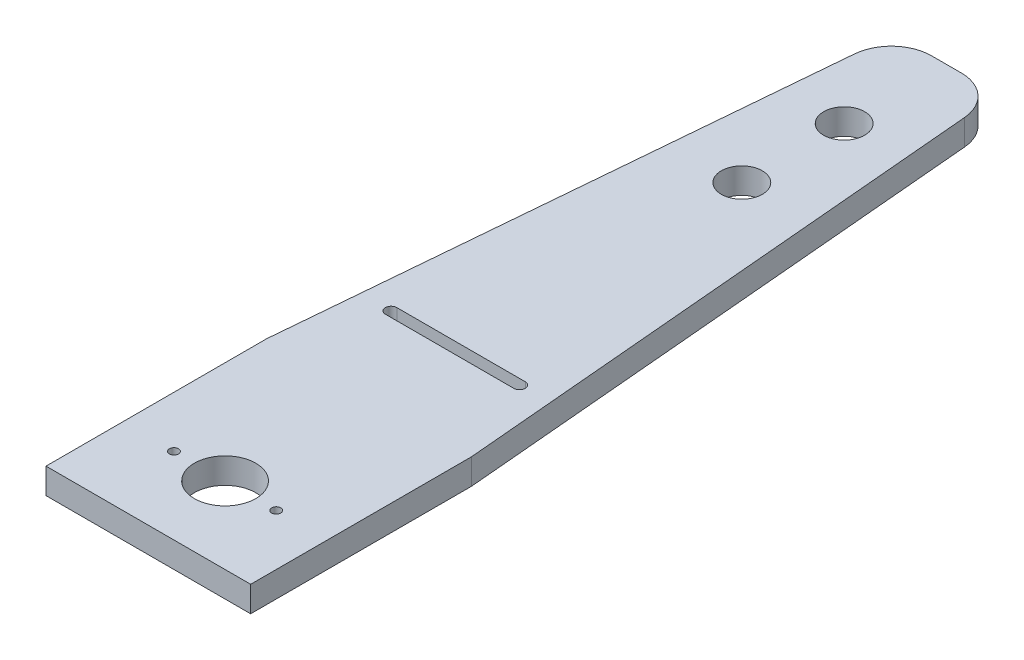
ISO-10303-21;
HEADER;
FILE_DESCRIPTION(('STEP AP214'),'2;1');
FILE_NAME('part.step','',(''),(''),'','','');
FILE_SCHEMA(('AUTOMOTIVE_DESIGN { 1 0 10303 214 1 1 1 1 }'));
ENDSEC;
DATA;
#1=APPLICATION_CONTEXT('core data for automotive mechanical design processes');
#2=APPLICATION_PROTOCOL_DEFINITION('international standard','automotive_design',2000,#1);
#3=PRODUCT_CONTEXT('',#1,'mechanical');
#4=PRODUCT('Part','Part','',(#3));
#5=PRODUCT_RELATED_PRODUCT_CATEGORY('part','',(#4));
#6=PRODUCT_DEFINITION_FORMATION('','',#4);
#7=PRODUCT_DEFINITION_CONTEXT('part definition',#1,'design');
#8=PRODUCT_DEFINITION('design','',#6,#7);
#9=PRODUCT_DEFINITION_SHAPE('','',#8);
#10=(LENGTH_UNIT() NAMED_UNIT(*) SI_UNIT(.MILLI.,.METRE.));
#11=(NAMED_UNIT(*) PLANE_ANGLE_UNIT() SI_UNIT($,.RADIAN.));
#12=(NAMED_UNIT(*) SI_UNIT($,.STERADIAN.) SOLID_ANGLE_UNIT());
#13=UNCERTAINTY_MEASURE_WITH_UNIT(LENGTH_MEASURE(1.E-05),#10,'distance_accuracy_value','');
#14=(GEOMETRIC_REPRESENTATION_CONTEXT(3) GLOBAL_UNCERTAINTY_ASSIGNED_CONTEXT((#13)) GLOBAL_UNIT_ASSIGNED_CONTEXT((#10,
#11,#12)) REPRESENTATION_CONTEXT('',''));
#15=CARTESIAN_POINT('',(0.,0.,0.));
#16=DIRECTION('',(0.,0.,1.));
#17=DIRECTION('',(1.,0.,0.));
#18=AXIS2_PLACEMENT_3D('',#15,#16,#17);
#19=CARTESIAN_POINT('',(0.,6.35,0.));
#20=DIRECTION('',(0.,-1.,0.));
#21=DIRECTION('',(0.,0.,-1.));
#22=AXIS2_PLACEMENT_3D('',#19,#20,#21);
#23=PLANE('',#22);
#24=DIRECTION('',(1.,0.,0.));
#25=VECTOR('',#24,1.);
#26=CARTESIAN_POINT('',(9.45935826457544,6.35,-74.7776));
#27=LINE('',#26,#25);
#28=CARTESIAN_POINT('',(9.45935826457544,6.35,-74.7776));
#29=VERTEX_POINT('',#28);
#30=CARTESIAN_POINT('',(41.3406417354246,6.35,-74.7776));
#31=VERTEX_POINT('',#30);
#32=EDGE_CURVE('E149',#29,#31,#27,.T.);
#33=ORIENTED_EDGE('',*,*,#32,.F.);
#34=CARTESIAN_POINT('',(9.45935826457544,6.35,-76.2));
#35=DIRECTION('',(0.,1.,0.));
#36=DIRECTION('',(0.,0.,1.));
#37=AXIS2_PLACEMENT_3D('',#34,#35,#36);
#38=CIRCLE('',#37,1.4224);
#39=CARTESIAN_POINT('',(9.45935826457544,6.35,-77.6224));
#40=VERTEX_POINT('',#39);
#41=EDGE_CURVE('E64',#40,#29,#38,.T.);
#42=ORIENTED_EDGE('',*,*,#41,.F.);
#43=DIRECTION('',(-1.,0.,0.));
#44=VECTOR('',#43,1.);
#45=CARTESIAN_POINT('',(9.45935826457544,6.35,-77.6224));
#46=LINE('',#45,#44);
#47=CARTESIAN_POINT('',(41.3406417354246,6.35,-77.6224));
#48=VERTEX_POINT('',#47);
#49=EDGE_CURVE('E155',#48,#40,#46,.T.);
#50=ORIENTED_EDGE('',*,*,#49,.F.);
#51=CARTESIAN_POINT('',(41.3406417354246,6.35,-76.2));
#52=DIRECTION('',(0.,1.,0.));
#53=DIRECTION('',(0.,0.,1.));
#54=AXIS2_PLACEMENT_3D('',#51,#52,#53);
#55=CIRCLE('',#54,1.4224);
#56=EDGE_CURVE('E140',#31,#48,#55,.T.);
#57=ORIENTED_EDGE('',*,*,#56,.F.);
#58=EDGE_LOOP('',(#33,#42,#50,#57));
#59=FACE_BOUND('',#58,.T.);
#60=CARTESIAN_POINT('',(25.4,6.35,-172.72));
#61=DIRECTION('',(0.,1.,0.));
#62=DIRECTION('',(0.,0.,1.));
#63=AXIS2_PLACEMENT_3D('',#60,#61,#62);
#64=CIRCLE('',#63,5.07999999999999);
#65=CARTESIAN_POINT('',(25.4,6.35,-167.64));
#66=VERTEX_POINT('',#65);
#67=EDGE_CURVE('E169',#66,#66,#64,.T.);
#68=ORIENTED_EDGE('',*,*,#67,.F.);
#69=EDGE_LOOP('',(#68));
#70=FACE_BOUND('',#69,.T.);
#71=CARTESIAN_POINT('',(25.4,6.35,-147.32));
#72=DIRECTION('',(0.,1.,0.));
#73=DIRECTION('',(0.,0.,1.));
#74=AXIS2_PLACEMENT_3D('',#71,#72,#73);
#75=CIRCLE('',#74,5.07999999999999);
#76=CARTESIAN_POINT('',(25.4,6.35,-142.24));
#77=VERTEX_POINT('',#76);
#78=EDGE_CURVE('E172',#77,#77,#75,.T.);
#79=ORIENTED_EDGE('',*,*,#78,.F.);
#80=EDGE_LOOP('',(#79));
#81=FACE_BOUND('',#80,.T.);
#82=DIRECTION('',(-1.,0.,0.));
#83=VECTOR('',#82,1.);
#84=CARTESIAN_POINT('',(0.,6.35,-198.12));
#85=LINE('',#84,#83);
#86=CARTESIAN_POINT('',(29.0966882598258,6.35,-198.12));
#87=VERTEX_POINT('',#86);
#88=CARTESIAN_POINT('',(21.7033117401742,6.35,-198.12));
#89=VERTEX_POINT('',#88);
#90=EDGE_CURVE('E203',#87,#89,#85,.T.);
#91=ORIENTED_EDGE('',*,*,#90,.T.);
#92=CARTESIAN_POINT('',(21.7033117401742,6.35,-188.12));
#93=DIRECTION('',(0.,-1.,0.));
#94=DIRECTION('',(0.,0.,-1.));
#95=AXIS2_PLACEMENT_3D('',#92,#93,#94);
#96=CIRCLE('',#95,10.);
#97=CARTESIAN_POINT('',(11.7413647592568,6.35,-188.991557427477));
#98=VERTEX_POINT('',#97);
#99=EDGE_CURVE('E243',#89,#98,#96,.F.);
#100=ORIENTED_EDGE('',*,*,#99,.T.);
#101=DIRECTION('',(0.0871557427476599,0.,-0.996194698091746));
#102=VECTOR('',#101,1.);
#103=CARTESIAN_POINT('',(0.,6.35,-54.7871441233755));
#104=LINE('',#103,#102);
#105=CARTESIAN_POINT('',(0.,6.35,-54.7871441233755));
#106=VERTEX_POINT('',#105);
#107=EDGE_CURVE('E227',#98,#106,#104,.F.);
#108=ORIENTED_EDGE('',*,*,#107,.T.);
#109=DIRECTION('',(0.,0.,1.));
#110=VECTOR('',#109,1.);
#111=CARTESIAN_POINT('',(0.,6.35,0.));
#112=LINE('',#111,#110);
#113=CARTESIAN_POINT('',(0.,6.35,0.));
#114=VERTEX_POINT('',#113);
#115=EDGE_CURVE('E195',#106,#114,#112,.T.);
#116=ORIENTED_EDGE('',*,*,#115,.T.);
#117=DIRECTION('',(1.,0.,0.));
#118=VECTOR('',#117,1.);
#119=CARTESIAN_POINT('',(0.,6.35,0.));
#120=LINE('',#119,#118);
#121=CARTESIAN_POINT('',(50.8,6.35,0.));
#122=VERTEX_POINT('',#121);
#123=EDGE_CURVE('E197',#114,#122,#120,.T.);
#124=ORIENTED_EDGE('',*,*,#123,.T.);
#125=DIRECTION('',(0.,0.,-1.));
#126=VECTOR('',#125,1.);
#127=CARTESIAN_POINT('',(50.8,6.35,0.));
#128=LINE('',#127,#126);
#129=CARTESIAN_POINT('',(50.8,6.35,-54.7871441233756));
#130=VERTEX_POINT('',#129);
#131=EDGE_CURVE('E200',#122,#130,#128,.T.);
#132=ORIENTED_EDGE('',*,*,#131,.T.);
#133=DIRECTION('',(0.0871557427476599,0.,0.996194698091746));
#134=VECTOR('',#133,1.);
#135=CARTESIAN_POINT('',(38.26,6.35,-198.12));
#136=LINE('',#135,#134);
#137=CARTESIAN_POINT('',(39.0586352407432,6.35,-188.991557427477));
#138=VERTEX_POINT('',#137);
#139=EDGE_CURVE('E229',#130,#138,#136,.F.);
#140=ORIENTED_EDGE('',*,*,#139,.T.);
#141=CARTESIAN_POINT('',(29.0966882598258,6.35,-188.12));
#142=DIRECTION('',(0.,-1.,0.));
#143=DIRECTION('',(0.,0.,-1.));
#144=AXIS2_PLACEMENT_3D('',#141,#142,#143);
#145=CIRCLE('',#144,10.);
#146=EDGE_CURVE('E241',#138,#87,#145,.F.);
#147=ORIENTED_EDGE('',*,*,#146,.T.);
#148=EDGE_LOOP('',(#91,#100,#108,#116,#124,#132,#140,#147));
#149=FACE_BOUND('',#148,.T.);
#150=CARTESIAN_POINT('',(12.7,6.35,-19.05));
#151=DIRECTION('',(0.,1.,0.));
#152=DIRECTION('',(0.,0.,1.));
#153=AXIS2_PLACEMENT_3D('',#150,#151,#152);
#154=CIRCLE('',#153,1.1303);
#155=CARTESIAN_POINT('',(12.7,6.35,-17.9197));
#156=VERTEX_POINT('',#155);
#157=EDGE_CURVE('E189',#156,#156,#154,.T.);
#158=ORIENTED_EDGE('',*,*,#157,.F.);
#159=EDGE_LOOP('',(#158));
#160=FACE_BOUND('',#159,.T.);
#161=CARTESIAN_POINT('',(38.1,6.35,-19.05));
#162=DIRECTION('',(0.,1.,0.));
#163=DIRECTION('',(0.,0.,1.));
#164=AXIS2_PLACEMENT_3D('',#161,#162,#163);
#165=CIRCLE('',#164,1.1303);
#166=CARTESIAN_POINT('',(38.1,6.35,-17.9197));
#167=VERTEX_POINT('',#166);
#168=EDGE_CURVE('E183',#167,#167,#165,.T.);
#169=ORIENTED_EDGE('',*,*,#168,.F.);
#170=EDGE_LOOP('',(#169));
#171=FACE_BOUND('',#170,.T.);
#172=CARTESIAN_POINT('',(25.4,6.35,-19.05));
#173=DIRECTION('',(0.,1.,0.));
#174=DIRECTION('',(0.,0.,1.));
#175=AXIS2_PLACEMENT_3D('',#172,#173,#174);
#176=CIRCLE('',#175,7.62);
#177=CARTESIAN_POINT('',(25.4,6.35,-11.43));
#178=VERTEX_POINT('',#177);
#179=EDGE_CURVE('E177',#178,#178,#176,.T.);
#180=ORIENTED_EDGE('',*,*,#179,.F.);
#181=EDGE_LOOP('',(#180));
#182=FACE_BOUND('',#181,.T.);
#183=ADVANCED_FACE('F49',(#59,#70,#81,#149,#160,#171,#182),#23,.F.);
#184=CARTESIAN_POINT('',(0.,0.,0.));
#185=DIRECTION('',(0.,-1.,0.));
#186=DIRECTION('',(0.,0.,-1.));
#187=AXIS2_PLACEMENT_3D('',#184,#185,#186);
#188=PLANE('',#187);
#189=CARTESIAN_POINT('',(9.45935826457544,0.,-76.2));
#190=DIRECTION('',(0.,-1.,0.));
#191=DIRECTION('',(0.,0.,-1.));
#192=AXIS2_PLACEMENT_3D('',#189,#190,#191);
#193=CIRCLE('',#192,1.4224);
#194=CARTESIAN_POINT('',(9.45935826457544,0.,-74.7776));
#195=VERTEX_POINT('',#194);
#196=CARTESIAN_POINT('',(9.45935826457544,0.,-77.6224));
#197=VERTEX_POINT('',#196);
#198=EDGE_CURVE('E11',#195,#197,#193,.T.);
#199=ORIENTED_EDGE('',*,*,#198,.F.);
#200=DIRECTION('',(-1.,0.,0.));
#201=VECTOR('',#200,1.);
#202=CARTESIAN_POINT('',(0.,0.,-74.7776));
#203=LINE('',#202,#201);
#204=CARTESIAN_POINT('',(41.3406417354246,0.,-74.7776));
#205=VERTEX_POINT('',#204);
#206=EDGE_CURVE('E253',#205,#195,#203,.T.);
#207=ORIENTED_EDGE('',*,*,#206,.F.);
#208=CARTESIAN_POINT('',(41.3406417354246,0.,-76.2));
#209=DIRECTION('',(0.,-1.,0.));
#210=DIRECTION('',(0.,0.,-1.));
#211=AXIS2_PLACEMENT_3D('',#208,#209,#210);
#212=CIRCLE('',#211,1.4224);
#213=CARTESIAN_POINT('',(41.3406417354246,0.,-77.6224));
#214=VERTEX_POINT('',#213);
#215=EDGE_CURVE('E143',#214,#205,#212,.T.);
#216=ORIENTED_EDGE('',*,*,#215,.F.);
#217=DIRECTION('',(1.,0.,0.));
#218=VECTOR('',#217,1.);
#219=CARTESIAN_POINT('',(0.,0.,-77.6224));
#220=LINE('',#219,#218);
#221=EDGE_CURVE('E57',#197,#214,#220,.T.);
#222=ORIENTED_EDGE('',*,*,#221,.F.);
#223=EDGE_LOOP('',(#199,#207,#216,#222));
#224=FACE_BOUND('',#223,.T.);
#225=CARTESIAN_POINT('',(25.4,0.,-172.72));
#226=DIRECTION('',(0.,1.,0.));
#227=DIRECTION('',(0.,0.,1.));
#228=AXIS2_PLACEMENT_3D('',#225,#226,#227);
#229=CIRCLE('',#228,5.07999999999999);
#230=CARTESIAN_POINT('',(25.4,0.,-167.64));
#231=VERTEX_POINT('',#230);
#232=EDGE_CURVE('E165',#231,#231,#229,.T.);
#233=ORIENTED_EDGE('',*,*,#232,.T.);
#234=EDGE_LOOP('',(#233));
#235=FACE_BOUND('',#234,.T.);
#236=CARTESIAN_POINT('',(25.4,0.,-147.32));
#237=DIRECTION('',(0.,1.,0.));
#238=DIRECTION('',(0.,0.,1.));
#239=AXIS2_PLACEMENT_3D('',#236,#237,#238);
#240=CIRCLE('',#239,5.07999999999999);
#241=CARTESIAN_POINT('',(25.4,0.,-142.24));
#242=VERTEX_POINT('',#241);
#243=EDGE_CURVE('E162',#242,#242,#240,.T.);
#244=ORIENTED_EDGE('',*,*,#243,.T.);
#245=EDGE_LOOP('',(#244));
#246=FACE_BOUND('',#245,.T.);
#247=CARTESIAN_POINT('',(38.1,0.,-19.05));
#248=DIRECTION('',(0.,1.,0.));
#249=DIRECTION('',(0.,0.,1.));
#250=AXIS2_PLACEMENT_3D('',#247,#248,#249);
#251=CIRCLE('',#250,1.1303);
#252=CARTESIAN_POINT('',(38.1,0.,-17.9197));
#253=VERTEX_POINT('',#252);
#254=EDGE_CURVE('E180',#253,#253,#251,.T.);
#255=ORIENTED_EDGE('',*,*,#254,.T.);
#256=EDGE_LOOP('',(#255));
#257=FACE_BOUND('',#256,.T.);
#258=DIRECTION('',(-0.0871557427476599,0.,0.996194698091746));
#259=VECTOR('',#258,1.);
#260=CARTESIAN_POINT('',(-4.75684386829991,0.,-0.416169912639054));
#261=LINE('',#260,#259);
#262=CARTESIAN_POINT('',(0.,0.,-54.7871441233755));
#263=VERTEX_POINT('',#262);
#264=CARTESIAN_POINT('',(11.7413647592568,0.,-188.991557427477));
#265=VERTEX_POINT('',#264);
#266=EDGE_CURVE('E220',#263,#265,#261,.F.);
#267=ORIENTED_EDGE('',*,*,#266,.T.);
#268=CARTESIAN_POINT('',(21.7033117401742,0.,-188.12));
#269=DIRECTION('',(0.,-1.,0.));
#270=DIRECTION('',(0.,0.,-1.));
#271=AXIS2_PLACEMENT_3D('',#268,#269,#270);
#272=CIRCLE('',#271,10.);
#273=CARTESIAN_POINT('',(21.7033117401742,0.,-198.12));
#274=VERTEX_POINT('',#273);
#275=EDGE_CURVE('E249',#265,#274,#272,.T.);
#276=ORIENTED_EDGE('',*,*,#275,.T.);
#277=DIRECTION('',(-1.,0.,0.));
#278=VECTOR('',#277,1.);
#279=CARTESIAN_POINT('',(0.,0.,-198.12));
#280=LINE('',#279,#278);
#281=CARTESIAN_POINT('',(29.0966882598258,0.,-198.12));
#282=VERTEX_POINT('',#281);
#283=EDGE_CURVE('E198',#282,#274,#280,.T.);
#284=ORIENTED_EDGE('',*,*,#283,.F.);
#285=CARTESIAN_POINT('',(29.0966882598258,0.,-188.12));
#286=DIRECTION('',(0.,-1.,0.));
#287=DIRECTION('',(0.,0.,-1.));
#288=AXIS2_PLACEMENT_3D('',#285,#286,#287);
#289=CIRCLE('',#288,10.);
#290=CARTESIAN_POINT('',(39.0586352407432,0.,-188.991557427477));
#291=VERTEX_POINT('',#290);
#292=EDGE_CURVE('E247',#282,#291,#289,.T.);
#293=ORIENTED_EDGE('',*,*,#292,.T.);
#294=DIRECTION('',(-0.0871557427476599,0.,-0.996194698091746));
#295=VECTOR('',#294,1.);
#296=CARTESIAN_POINT('',(55.17096079481,0.,-4.82683362537917));
#297=LINE('',#296,#295);
#298=CARTESIAN_POINT('',(50.8,0.,-54.7871441233756));
#299=VERTEX_POINT('',#298);
#300=EDGE_CURVE('E223',#291,#299,#297,.F.);
#301=ORIENTED_EDGE('',*,*,#300,.T.);
#302=DIRECTION('',(0.,0.,-1.));
#303=VECTOR('',#302,1.);
#304=CARTESIAN_POINT('',(50.8,0.,0.));
#305=LINE('',#304,#303);
#306=CARTESIAN_POINT('',(50.8,0.,0.));
#307=VERTEX_POINT('',#306);
#308=EDGE_CURVE('E210',#307,#299,#305,.T.);
#309=ORIENTED_EDGE('',*,*,#308,.F.);
#310=DIRECTION('',(1.,0.,0.));
#311=VECTOR('',#310,1.);
#312=CARTESIAN_POINT('',(0.,0.,0.));
#313=LINE('',#312,#311);
#314=CARTESIAN_POINT('',(0.,0.,0.));
#315=VERTEX_POINT('',#314);
#316=EDGE_CURVE('E208',#315,#307,#313,.T.);
#317=ORIENTED_EDGE('',*,*,#316,.F.);
#318=DIRECTION('',(0.,0.,1.));
#319=VECTOR('',#318,1.);
#320=CARTESIAN_POINT('',(0.,0.,0.));
#321=LINE('',#320,#319);
#322=EDGE_CURVE('E192',#263,#315,#321,.T.);
#323=ORIENTED_EDGE('',*,*,#322,.F.);
#324=EDGE_LOOP('',(#267,#276,#284,#293,#301,#309,#317,#323));
#325=FACE_BOUND('',#324,.T.);
#326=CARTESIAN_POINT('',(12.7,0.,-19.05));
#327=DIRECTION('',(0.,1.,0.));
#328=DIRECTION('',(0.,0.,1.));
#329=AXIS2_PLACEMENT_3D('',#326,#327,#328);
#330=CIRCLE('',#329,1.1303);
#331=CARTESIAN_POINT('',(12.7,0.,-17.9197));
#332=VERTEX_POINT('',#331);
#333=EDGE_CURVE('E186',#332,#332,#330,.T.);
#334=ORIENTED_EDGE('',*,*,#333,.T.);
#335=EDGE_LOOP('',(#334));
#336=FACE_BOUND('',#335,.T.);
#337=CARTESIAN_POINT('',(25.4,0.,-19.05));
#338=DIRECTION('',(0.,1.,0.));
#339=DIRECTION('',(0.,0.,1.));
#340=AXIS2_PLACEMENT_3D('',#337,#338,#339);
#341=CIRCLE('',#340,7.62);
#342=CARTESIAN_POINT('',(25.4,0.,-11.43));
#343=VERTEX_POINT('',#342);
#344=EDGE_CURVE('E168',#343,#343,#341,.T.);
#345=ORIENTED_EDGE('',*,*,#344,.T.);
#346=EDGE_LOOP('',(#345));
#347=FACE_BOUND('',#346,.T.);
#348=ADVANCED_FACE('F261',(#224,#235,#246,#257,#325,#336,#347),#188,.T.);
#349=CARTESIAN_POINT('',(0.,6.35,0.));
#350=DIRECTION('',(1.,0.,0.));
#351=DIRECTION('',(0.,0.,-1.));
#352=AXIS2_PLACEMENT_3D('',#349,#350,#351);
#353=PLANE('',#352);
#354=ORIENTED_EDGE('',*,*,#115,.F.);
#355=DIRECTION('',(0.,-1.,0.));
#356=VECTOR('',#355,1.);
#357=CARTESIAN_POINT('',(0.,6.35,-54.7871441233755));
#358=LINE('',#357,#356);
#359=EDGE_CURVE('E232',#106,#263,#358,.T.);
#360=ORIENTED_EDGE('',*,*,#359,.T.);
#361=ORIENTED_EDGE('',*,*,#322,.T.);
#362=DIRECTION('',(0.,-1.,0.));
#363=VECTOR('',#362,1.);
#364=CARTESIAN_POINT('',(0.,6.35,0.));
#365=LINE('',#364,#363);
#366=EDGE_CURVE('E217',#114,#315,#365,.T.);
#367=ORIENTED_EDGE('',*,*,#366,.F.);
#368=EDGE_LOOP('',(#354,#360,#361,#367));
#369=FACE_BOUND('',#368,.T.);
#370=ADVANCED_FACE('F280',(#369),#353,.F.);
#371=CARTESIAN_POINT('',(0.,6.35,0.));
#372=DIRECTION('',(0.,0.,-1.));
#373=DIRECTION('',(-1.,0.,0.));
#374=AXIS2_PLACEMENT_3D('',#371,#372,#373);
#375=PLANE('',#374);
#376=ORIENTED_EDGE('',*,*,#316,.T.);
#377=DIRECTION('',(0.,-1.,0.));
#378=VECTOR('',#377,1.);
#379=CARTESIAN_POINT('',(50.8,6.35,0.));
#380=LINE('',#379,#378);
#381=EDGE_CURVE('E206',#122,#307,#380,.T.);
#382=ORIENTED_EDGE('',*,*,#381,.F.);
#383=ORIENTED_EDGE('',*,*,#123,.F.);
#384=ORIENTED_EDGE('',*,*,#366,.T.);
#385=EDGE_LOOP('',(#376,#382,#383,#384));
#386=FACE_BOUND('',#385,.T.);
#387=ADVANCED_FACE('F293',(#386),#375,.F.);
#388=CARTESIAN_POINT('',(50.8,6.35,0.));
#389=DIRECTION('',(-1.,0.,0.));
#390=DIRECTION('',(0.,0.,1.));
#391=AXIS2_PLACEMENT_3D('',#388,#389,#390);
#392=PLANE('',#391);
#393=ORIENTED_EDGE('',*,*,#308,.T.);
#394=DIRECTION('',(0.,1.,0.));
#395=VECTOR('',#394,1.);
#396=CARTESIAN_POINT('',(50.8,6.35,-54.7871441233756));
#397=LINE('',#396,#395);
#398=EDGE_CURVE('E225',#299,#130,#397,.T.);
#399=ORIENTED_EDGE('',*,*,#398,.T.);
#400=ORIENTED_EDGE('',*,*,#131,.F.);
#401=ORIENTED_EDGE('',*,*,#381,.T.);
#402=EDGE_LOOP('',(#393,#399,#400,#401));
#403=FACE_BOUND('',#402,.T.);
#404=ADVANCED_FACE('F289',(#403),#392,.F.);
#405=CARTESIAN_POINT('',(0.,6.35,-198.12));
#406=DIRECTION('',(0.,0.,1.));
#407=DIRECTION('',(1.,0.,0.));
#408=AXIS2_PLACEMENT_3D('',#405,#406,#407);
#409=PLANE('',#408);
#410=ORIENTED_EDGE('',*,*,#283,.T.);
#411=DIRECTION('',(0.,-1.,0.));
#412=VECTOR('',#411,1.);
#413=CARTESIAN_POINT('',(21.7033117401742,6.35,-198.12));
#414=LINE('',#413,#412);
#415=EDGE_CURVE('E238',#274,#89,#414,.F.);
#416=ORIENTED_EDGE('',*,*,#415,.T.);
#417=ORIENTED_EDGE('',*,*,#90,.F.);
#418=DIRECTION('',(0.,1.,0.));
#419=VECTOR('',#418,1.);
#420=CARTESIAN_POINT('',(29.0966882598258,0.,-198.12));
#421=LINE('',#420,#419);
#422=EDGE_CURVE('E235',#87,#282,#421,.F.);
#423=ORIENTED_EDGE('',*,*,#422,.T.);
#424=EDGE_LOOP('',(#410,#416,#417,#423));
#425=FACE_BOUND('',#424,.T.);
#426=ADVANCED_FACE('F286',(#425),#409,.F.);
#427=CARTESIAN_POINT('',(12.7,6.35,-19.05));
#428=DIRECTION('',(0.,-1.,0.));
#429=DIRECTION('',(0.,0.,-1.));
#430=AXIS2_PLACEMENT_3D('',#427,#428,#429);
#431=CYLINDRICAL_SURFACE('',#430,1.1303);
#432=ORIENTED_EDGE('',*,*,#157,.T.);
#433=EDGE_LOOP('',(#432));
#434=FACE_BOUND('',#433,.T.);
#435=ORIENTED_EDGE('',*,*,#333,.F.);
#436=EDGE_LOOP('',(#435));
#437=FACE_BOUND('',#436,.T.);
#438=ADVANCED_FACE('F283',(#434,#437),#431,.F.);
#439=CARTESIAN_POINT('',(38.1,6.35,-19.05));
#440=DIRECTION('',(0.,-1.,0.));
#441=DIRECTION('',(0.,0.,-1.));
#442=AXIS2_PLACEMENT_3D('',#439,#440,#441);
#443=CYLINDRICAL_SURFACE('',#442,1.1303);
#444=ORIENTED_EDGE('',*,*,#168,.T.);
#445=EDGE_LOOP('',(#444));
#446=FACE_BOUND('',#445,.T.);
#447=ORIENTED_EDGE('',*,*,#254,.F.);
#448=EDGE_LOOP('',(#447));
#449=FACE_BOUND('',#448,.T.);
#450=ADVANCED_FACE('F354',(#446,#449),#443,.F.);
#451=CARTESIAN_POINT('',(25.4,6.35,-19.05));
#452=DIRECTION('',(0.,-1.,0.));
#453=DIRECTION('',(0.,0.,-1.));
#454=AXIS2_PLACEMENT_3D('',#451,#452,#453);
#455=CYLINDRICAL_SURFACE('',#454,7.62);
#456=ORIENTED_EDGE('',*,*,#179,.T.);
#457=EDGE_LOOP('',(#456));
#458=FACE_BOUND('',#457,.T.);
#459=ORIENTED_EDGE('',*,*,#344,.F.);
#460=EDGE_LOOP('',(#459));
#461=FACE_BOUND('',#460,.T.);
#462=ADVANCED_FACE('F350',(#458,#461),#455,.F.);
#463=CARTESIAN_POINT('',(25.4,0.,-147.32));
#464=DIRECTION('',(0.,1.,0.));
#465=DIRECTION('',(0.,0.,1.));
#466=AXIS2_PLACEMENT_3D('',#463,#464,#465);
#467=CYLINDRICAL_SURFACE('',#466,5.07999999999999);
#468=ORIENTED_EDGE('',*,*,#243,.F.);
#469=EDGE_LOOP('',(#468));
#470=FACE_BOUND('',#469,.T.);
#471=ORIENTED_EDGE('',*,*,#78,.T.);
#472=EDGE_LOOP('',(#471));
#473=FACE_BOUND('',#472,.T.);
#474=ADVANCED_FACE('F353',(#470,#473),#467,.F.);
#475=CARTESIAN_POINT('',(25.4,0.,-172.72));
#476=DIRECTION('',(0.,1.,0.));
#477=DIRECTION('',(0.,0.,1.));
#478=AXIS2_PLACEMENT_3D('',#475,#476,#477);
#479=CYLINDRICAL_SURFACE('',#478,5.07999999999999);
#480=ORIENTED_EDGE('',*,*,#232,.F.);
#481=EDGE_LOOP('',(#480));
#482=FACE_BOUND('',#481,.T.);
#483=ORIENTED_EDGE('',*,*,#67,.T.);
#484=EDGE_LOOP('',(#483));
#485=FACE_BOUND('',#484,.T.);
#486=ADVANCED_FACE('F309',(#482,#485),#479,.F.);
#487=CARTESIAN_POINT('',(38.26,6.35,-198.12));
#488=DIRECTION('',(-0.996194698091745,0.,0.0871557427476599));
#489=DIRECTION('',(0.,-1.,0.));
#490=AXIS2_PLACEMENT_3D('',#487,#488,#489);
#491=PLANE('',#490);
#492=ORIENTED_EDGE('',*,*,#300,.F.);
#493=DIRECTION('',(0.,-1.,0.));
#494=VECTOR('',#493,1.);
#495=CARTESIAN_POINT('',(39.0586352407432,6.35,-188.991557427477));
#496=LINE('',#495,#494);
#497=EDGE_CURVE('E251',#291,#138,#496,.F.);
#498=ORIENTED_EDGE('',*,*,#497,.T.);
#499=ORIENTED_EDGE('',*,*,#139,.F.);
#500=ORIENTED_EDGE('',*,*,#398,.F.);
#501=EDGE_LOOP('',(#492,#498,#499,#500));
#502=FACE_BOUND('',#501,.T.);
#503=ADVANCED_FACE('F302',(#502),#491,.F.);
#504=CARTESIAN_POINT('',(0.,6.35,-54.7871441233755));
#505=DIRECTION('',(0.996194698091745,0.,0.0871557427476599));
#506=DIRECTION('',(0.,-1.,0.));
#507=AXIS2_PLACEMENT_3D('',#504,#505,#506);
#508=PLANE('',#507);
#509=ORIENTED_EDGE('',*,*,#107,.F.);
#510=DIRECTION('',(0.,1.,0.));
#511=VECTOR('',#510,1.);
#512=CARTESIAN_POINT('',(11.7413647592568,0.,-188.991557427477));
#513=LINE('',#512,#511);
#514=EDGE_CURVE('E245',#98,#265,#513,.F.);
#515=ORIENTED_EDGE('',*,*,#514,.T.);
#516=ORIENTED_EDGE('',*,*,#266,.F.);
#517=ORIENTED_EDGE('',*,*,#359,.F.);
#518=EDGE_LOOP('',(#509,#515,#516,#517));
#519=FACE_BOUND('',#518,.T.);
#520=ADVANCED_FACE('F308',(#519),#508,.F.);
#521=CARTESIAN_POINT('',(21.7033117401742,6.35,-188.12));
#522=DIRECTION('',(0.,1.,0.));
#523=DIRECTION('',(0.,0.,1.));
#524=AXIS2_PLACEMENT_3D('',#521,#522,#523);
#525=CYLINDRICAL_SURFACE('',#524,10.);
#526=ORIENTED_EDGE('',*,*,#275,.F.);
#527=ORIENTED_EDGE('',*,*,#514,.F.);
#528=ORIENTED_EDGE('',*,*,#99,.F.);
#529=ORIENTED_EDGE('',*,*,#415,.F.);
#530=EDGE_LOOP('',(#526,#527,#528,#529));
#531=FACE_BOUND('',#530,.T.);
#532=ADVANCED_FACE('F272',(#531),#525,.T.);
#533=CARTESIAN_POINT('',(29.0966882598258,6.35,-188.12));
#534=DIRECTION('',(0.,-1.,0.));
#535=DIRECTION('',(0.,0.,-1.));
#536=AXIS2_PLACEMENT_3D('',#533,#534,#535);
#537=CYLINDRICAL_SURFACE('',#536,10.);
#538=ORIENTED_EDGE('',*,*,#146,.F.);
#539=ORIENTED_EDGE('',*,*,#497,.F.);
#540=ORIENTED_EDGE('',*,*,#292,.F.);
#541=ORIENTED_EDGE('',*,*,#422,.F.);
#542=EDGE_LOOP('',(#538,#539,#540,#541));
#543=FACE_BOUND('',#542,.T.);
#544=ADVANCED_FACE('F51',(#543),#537,.T.);
#545=CARTESIAN_POINT('',(9.45935826457544,-4.318,-76.2));
#546=DIRECTION('',(0.,1.,0.));
#547=DIRECTION('',(0.,0.,1.));
#548=AXIS2_PLACEMENT_3D('',#545,#546,#547);
#549=CYLINDRICAL_SURFACE('',#548,1.4224);
#550=ORIENTED_EDGE('',*,*,#198,.T.);
#551=DIRECTION('',(0.,1.,0.));
#552=VECTOR('',#551,1.);
#553=CARTESIAN_POINT('',(9.45935826457544,-4.318,-77.6224));
#554=LINE('',#553,#552);
#555=EDGE_CURVE('E160',#197,#40,#554,.T.);
#556=ORIENTED_EDGE('',*,*,#555,.T.);
#557=ORIENTED_EDGE('',*,*,#41,.T.);
#558=DIRECTION('',(0.,1.,0.));
#559=VECTOR('',#558,1.);
#560=CARTESIAN_POINT('',(9.45935826457544,-4.318,-74.7776));
#561=LINE('',#560,#559);
#562=EDGE_CURVE('E146',#195,#29,#561,.T.);
#563=ORIENTED_EDGE('',*,*,#562,.F.);
#564=EDGE_LOOP('',(#550,#556,#557,#563));
#565=FACE_BOUND('',#564,.T.);
#566=ADVANCED_FACE('F263',(#565),#549,.F.);
#567=CARTESIAN_POINT('',(9.45935826457544,-4.318,-77.6224));
#568=DIRECTION('',(0.,0.,-1.));
#569=DIRECTION('',(-1.,0.,0.));
#570=AXIS2_PLACEMENT_3D('',#567,#568,#569);
#571=PLANE('',#570);
#572=ORIENTED_EDGE('',*,*,#221,.T.);
#573=DIRECTION('',(0.,1.,0.));
#574=VECTOR('',#573,1.);
#575=CARTESIAN_POINT('',(41.3406417354246,-4.318,-77.6224));
#576=LINE('',#575,#574);
#577=EDGE_CURVE('E145',#214,#48,#576,.T.);
#578=ORIENTED_EDGE('',*,*,#577,.T.);
#579=ORIENTED_EDGE('',*,*,#49,.T.);
#580=ORIENTED_EDGE('',*,*,#555,.F.);
#581=EDGE_LOOP('',(#572,#578,#579,#580));
#582=FACE_BOUND('',#581,.T.);
#583=ADVANCED_FACE('F258',(#582),#571,.F.);
#584=CARTESIAN_POINT('',(41.3406417354246,-4.318,-76.2));
#585=DIRECTION('',(0.,1.,0.));
#586=DIRECTION('',(0.,0.,1.));
#587=AXIS2_PLACEMENT_3D('',#584,#585,#586);
#588=CYLINDRICAL_SURFACE('',#587,1.4224);
#589=ORIENTED_EDGE('',*,*,#215,.T.);
#590=DIRECTION('',(0.,1.,0.));
#591=VECTOR('',#590,1.);
#592=CARTESIAN_POINT('',(41.3406417354246,-4.318,-74.7776));
#593=LINE('',#592,#591);
#594=EDGE_CURVE('E72',#205,#31,#593,.T.);
#595=ORIENTED_EDGE('',*,*,#594,.T.);
#596=ORIENTED_EDGE('',*,*,#56,.T.);
#597=ORIENTED_EDGE('',*,*,#577,.F.);
#598=EDGE_LOOP('',(#589,#595,#596,#597));
#599=FACE_BOUND('',#598,.T.);
#600=ADVANCED_FACE('F137',(#599),#588,.F.);
#601=CARTESIAN_POINT('',(9.45935826457544,-4.318,-74.7776));
#602=DIRECTION('',(0.,0.,1.));
#603=DIRECTION('',(1.,0.,0.));
#604=AXIS2_PLACEMENT_3D('',#601,#602,#603);
#605=PLANE('',#604);
#606=ORIENTED_EDGE('',*,*,#206,.T.);
#607=ORIENTED_EDGE('',*,*,#562,.T.);
#608=ORIENTED_EDGE('',*,*,#32,.T.);
#609=ORIENTED_EDGE('',*,*,#594,.F.);
#610=EDGE_LOOP('',(#606,#607,#608,#609));
#611=FACE_BOUND('',#610,.T.);
#612=ADVANCED_FACE('F150',(#611),#605,.F.);
#613=CLOSED_SHELL('',(#183,#348,#370,#387,#404,#426,#438,#450,#462,#474,#486,#503,#520,#532,
#544,#566,#583,#600,#612));
#614=MANIFOLD_SOLID_BREP('B2',#613);
#615=ADVANCED_BREP_SHAPE_REPRESENTATION('',(#18,#614),#14);
#616=SHAPE_DEFINITION_REPRESENTATION(#9,#615);
ENDSEC;
END-ISO-10303-21;
